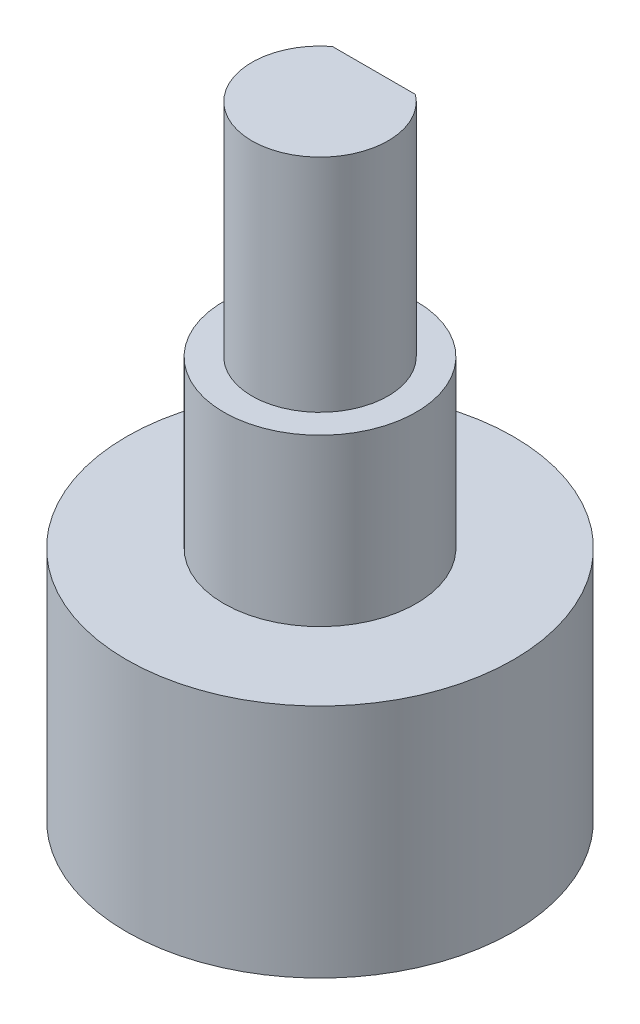
ISO-10303-21;
HEADER;
FILE_DESCRIPTION(('STEP AP214'),'2;1');
FILE_NAME('part.step','',(''),(''),'','','');
FILE_SCHEMA(('AUTOMOTIVE_DESIGN { 1 0 10303 214 1 1 1 1 }'));
ENDSEC;
DATA;
#1=APPLICATION_CONTEXT('core data for automotive mechanical design processes');
#2=APPLICATION_PROTOCOL_DEFINITION('international standard','automotive_design',2000,#1);
#3=PRODUCT_CONTEXT('',#1,'mechanical');
#4=PRODUCT('Part','Part','',(#3));
#5=PRODUCT_RELATED_PRODUCT_CATEGORY('part','',(#4));
#6=PRODUCT_DEFINITION_FORMATION('','',#4);
#7=PRODUCT_DEFINITION_CONTEXT('part definition',#1,'design');
#8=PRODUCT_DEFINITION('design','',#6,#7);
#9=PRODUCT_DEFINITION_SHAPE('','',#8);
#10=(LENGTH_UNIT() NAMED_UNIT(*) SI_UNIT(.MILLI.,.METRE.));
#11=(NAMED_UNIT(*) PLANE_ANGLE_UNIT() SI_UNIT($,.RADIAN.));
#12=(NAMED_UNIT(*) SI_UNIT($,.STERADIAN.) SOLID_ANGLE_UNIT());
#13=UNCERTAINTY_MEASURE_WITH_UNIT(LENGTH_MEASURE(1.E-05),#10,'distance_accuracy_value','');
#14=(GEOMETRIC_REPRESENTATION_CONTEXT(3) GLOBAL_UNCERTAINTY_ASSIGNED_CONTEXT((#13)) GLOBAL_UNIT_ASSIGNED_CONTEXT((#10,
#11,#12)) REPRESENTATION_CONTEXT('',''));
#15=CARTESIAN_POINT('',(0.,0.,0.));
#16=DIRECTION('',(0.,0.,1.));
#17=DIRECTION('',(1.,0.,0.));
#18=AXIS2_PLACEMENT_3D('',#15,#16,#17);
#19=CARTESIAN_POINT('',(0.,23.065,0.));
#20=DIRECTION('',(0.,1.,0.));
#21=DIRECTION('',(0.,0.,1.));
#22=AXIS2_PLACEMENT_3D('',#19,#20,#21);
#23=PLANE('',#22);
#24=CARTESIAN_POINT('',(0.,23.065,0.));
#25=DIRECTION('',(0.,1.,0.));
#26=DIRECTION('',(0.,0.,1.));
#27=AXIS2_PLACEMENT_3D('',#24,#25,#26);
#28=CIRCLE('',#27,5.5245);
#29=CARTESIAN_POINT('',(0.,23.065,-5.5245));
#30=VERTEX_POINT('',#29);
#31=EDGE_CURVE('E79',#30,#30,#28,.T.);
#32=ORIENTED_EDGE('',*,*,#31,.T.);
#33=EDGE_LOOP('',(#32));
#34=FACE_BOUND('',#33,.T.);
#35=DIRECTION('',(-1.,0.,0.));
#36=VECTOR('',#35,1.);
#37=CARTESIAN_POINT('',(2.38705951329245,23.065,-3.0988));
#38=LINE('',#37,#36);
#39=CARTESIAN_POINT('',(2.38705951329245,23.065,-3.0988));
#40=VERTEX_POINT('',#39);
#41=CARTESIAN_POINT('',(-2.38705951329245,23.065,-3.0988));
#42=VERTEX_POINT('',#41);
#43=EDGE_CURVE('E63',#40,#42,#38,.T.);
#44=ORIENTED_EDGE('',*,*,#43,.F.);
#45=CARTESIAN_POINT('',(0.,23.065,0.));
#46=DIRECTION('',(0.,1.,0.));
#47=DIRECTION('',(0.,0.,1.));
#48=AXIS2_PLACEMENT_3D('',#45,#46,#47);
#49=CIRCLE('',#48,3.9116);
#50=EDGE_CURVE('E48',#42,#40,#49,.T.);
#51=ORIENTED_EDGE('',*,*,#50,.F.);
#52=EDGE_LOOP('',(#44,#51));
#53=FACE_BOUND('',#52,.T.);
#54=ADVANCED_FACE('F33',(#34,#53),#23,.T.);
#55=CARTESIAN_POINT('',(0.,13.54,0.));
#56=DIRECTION('',(0.,-1.,0.));
#57=DIRECTION('',(0.,0.,-1.));
#58=AXIS2_PLACEMENT_3D('',#55,#56,#57);
#59=CYLINDRICAL_SURFACE('',#58,11.1125);
#60=CARTESIAN_POINT('',(0.,13.54,0.));
#61=DIRECTION('',(0.,1.,0.));
#62=DIRECTION('',(0.,0.,1.));
#63=AXIS2_PLACEMENT_3D('',#60,#61,#62);
#64=CIRCLE('',#63,11.1125);
#65=CARTESIAN_POINT('',(0.,13.54,11.1125));
#66=VERTEX_POINT('',#65);
#67=EDGE_CURVE('E11',#66,#66,#64,.T.);
#68=ORIENTED_EDGE('',*,*,#67,.F.);
#69=EDGE_LOOP('',(#68));
#70=FACE_BOUND('',#69,.T.);
#71=CARTESIAN_POINT('',(0.,0.,0.));
#72=DIRECTION('',(0.,1.,0.));
#73=DIRECTION('',(0.,0.,1.));
#74=AXIS2_PLACEMENT_3D('',#71,#72,#73);
#75=CIRCLE('',#74,11.1125);
#76=CARTESIAN_POINT('',(0.,0.,11.1125));
#77=VERTEX_POINT('',#76);
#78=EDGE_CURVE('E37',#77,#77,#75,.T.);
#79=ORIENTED_EDGE('',*,*,#78,.T.);
#80=EDGE_LOOP('',(#79));
#81=FACE_BOUND('',#80,.T.);
#82=ADVANCED_FACE('F35',(#70,#81),#59,.T.);
#83=CARTESIAN_POINT('',(0.,13.54,0.));
#84=DIRECTION('',(0.,1.,0.));
#85=DIRECTION('',(0.,0.,1.));
#86=AXIS2_PLACEMENT_3D('',#83,#84,#85);
#87=PLANE('',#86);
#88=CARTESIAN_POINT('',(0.,13.54,0.));
#89=DIRECTION('',(0.,1.,0.));
#90=DIRECTION('',(0.,0.,1.));
#91=AXIS2_PLACEMENT_3D('',#88,#89,#90);
#92=CIRCLE('',#91,5.5245);
#93=CARTESIAN_POINT('',(0.,13.54,-5.5245));
#94=VERTEX_POINT('',#93);
#95=EDGE_CURVE('E78',#94,#94,#92,.T.);
#96=ORIENTED_EDGE('',*,*,#95,.F.);
#97=EDGE_LOOP('',(#96));
#98=FACE_BOUND('',#97,.T.);
#99=ORIENTED_EDGE('',*,*,#67,.T.);
#100=EDGE_LOOP('',(#99));
#101=FACE_BOUND('',#100,.T.);
#102=ADVANCED_FACE('F87',(#98,#101),#87,.T.);
#103=CARTESIAN_POINT('',(0.,0.,0.));
#104=DIRECTION('',(0.,1.,0.));
#105=DIRECTION('',(0.,0.,1.));
#106=AXIS2_PLACEMENT_3D('',#103,#104,#105);
#107=PLANE('',#106);
#108=ORIENTED_EDGE('',*,*,#78,.F.);
#109=EDGE_LOOP('',(#108));
#110=FACE_BOUND('',#109,.T.);
#111=ADVANCED_FACE('F90',(#110),#107,.F.);
#112=CARTESIAN_POINT('',(0.,23.065,0.));
#113=DIRECTION('',(0.,-1.,0.));
#114=DIRECTION('',(0.,0.,-1.));
#115=AXIS2_PLACEMENT_3D('',#112,#113,#114);
#116=CYLINDRICAL_SURFACE('',#115,5.5245);
#117=CARTESIAN_POINT('',(0.,23.065,-5.5245));
#118=CARTESIAN_POINT('',(0.,22.96578125,-5.5245));
#119=CARTESIAN_POINT('',(0.,22.8665625,-5.5245));
#120=CARTESIAN_POINT('',(0.,22.668125,-5.5245));
#121=CARTESIAN_POINT('',(0.,22.56890625,-5.5245));
#122=CARTESIAN_POINT('',(0.,22.37046875,-5.5245));
#123=CARTESIAN_POINT('',(0.,22.27125,-5.5245));
#124=CARTESIAN_POINT('',(0.,22.0728125,-5.5245));
#125=CARTESIAN_POINT('',(0.,21.97359375,-5.5245));
#126=CARTESIAN_POINT('',(0.,21.77515625,-5.5245));
#127=CARTESIAN_POINT('',(0.,21.6759375,-5.5245));
#128=CARTESIAN_POINT('',(0.,21.4775,-5.5245));
#129=CARTESIAN_POINT('',(0.,21.37828125,-5.5245));
#130=CARTESIAN_POINT('',(0.,21.17984375,-5.5245));
#131=CARTESIAN_POINT('',(0.,21.080625,-5.5245));
#132=CARTESIAN_POINT('',(0.,20.8821875,-5.5245));
#133=CARTESIAN_POINT('',(0.,20.78296875,-5.5245));
#134=CARTESIAN_POINT('',(0.,20.58453125,-5.5245));
#135=CARTESIAN_POINT('',(0.,20.4853125,-5.5245));
#136=CARTESIAN_POINT('',(0.,20.286875,-5.5245));
#137=CARTESIAN_POINT('',(0.,20.18765625,-5.5245));
#138=CARTESIAN_POINT('',(0.,19.98921875,-5.5245));
#139=CARTESIAN_POINT('',(0.,19.89,-5.5245));
#140=CARTESIAN_POINT('',(0.,19.6915625,-5.5245));
#141=CARTESIAN_POINT('',(0.,19.59234375,-5.5245));
#142=CARTESIAN_POINT('',(0.,19.39390625,-5.5245));
#143=CARTESIAN_POINT('',(0.,19.2946875,-5.5245));
#144=CARTESIAN_POINT('',(0.,19.09625,-5.5245));
#145=CARTESIAN_POINT('',(0.,18.99703125,-5.5245));
#146=CARTESIAN_POINT('',(0.,18.79859375,-5.5245));
#147=CARTESIAN_POINT('',(0.,18.699375,-5.5245));
#148=CARTESIAN_POINT('',(0.,18.5009375,-5.5245));
#149=CARTESIAN_POINT('',(0.,18.40171875,-5.5245));
#150=CARTESIAN_POINT('',(0.,18.20328125,-5.5245));
#151=CARTESIAN_POINT('',(0.,18.1040625,-5.5245));
#152=CARTESIAN_POINT('',(0.,17.905625,-5.5245));
#153=CARTESIAN_POINT('',(0.,17.80640625,-5.5245));
#154=CARTESIAN_POINT('',(0.,17.60796875,-5.5245));
#155=CARTESIAN_POINT('',(0.,17.50875,-5.5245));
#156=CARTESIAN_POINT('',(0.,17.3103125,-5.5245));
#157=CARTESIAN_POINT('',(0.,17.21109375,-5.5245));
#158=CARTESIAN_POINT('',(0.,17.01265625,-5.5245));
#159=CARTESIAN_POINT('',(0.,16.9134375,-5.5245));
#160=CARTESIAN_POINT('',(0.,16.715,-5.5245));
#161=CARTESIAN_POINT('',(0.,16.61578125,-5.5245));
#162=CARTESIAN_POINT('',(0.,16.41734375,-5.5245));
#163=CARTESIAN_POINT('',(0.,16.318125,-5.5245));
#164=CARTESIAN_POINT('',(0.,16.1196875,-5.5245));
#165=CARTESIAN_POINT('',(0.,16.02046875,-5.5245));
#166=CARTESIAN_POINT('',(0.,15.82203125,-5.5245));
#167=CARTESIAN_POINT('',(0.,15.7228125,-5.5245));
#168=CARTESIAN_POINT('',(0.,15.524375,-5.5245));
#169=CARTESIAN_POINT('',(0.,15.42515625,-5.5245));
#170=CARTESIAN_POINT('',(0.,15.22671875,-5.5245));
#171=CARTESIAN_POINT('',(0.,15.1275,-5.5245));
#172=CARTESIAN_POINT('',(0.,14.9290625,-5.5245));
#173=CARTESIAN_POINT('',(0.,14.82984375,-5.5245));
#174=CARTESIAN_POINT('',(0.,14.63140625,-5.5245));
#175=CARTESIAN_POINT('',(0.,14.5321875,-5.5245));
#176=CARTESIAN_POINT('',(0.,14.33375,-5.5245));
#177=CARTESIAN_POINT('',(0.,14.23453125,-5.5245));
#178=CARTESIAN_POINT('',(0.,14.03609375,-5.5245));
#179=CARTESIAN_POINT('',(0.,13.936875,-5.5245));
#180=CARTESIAN_POINT('',(0.,13.7384375,-5.5245));
#181=CARTESIAN_POINT('',(0.,13.63921875,-5.5245));
#182=CARTESIAN_POINT('',(0.,13.54,-5.5245));
#183=B_SPLINE_CURVE_WITH_KNOTS('',3,(#117,#118,#119,#120,#121,#122,#123,#124,#125,#126,#127,
#128,#129,#130,#131,#132,#133,#134,#135,#136,#137,#138,#139,#140,#141,#142,#143,#144,#145,#146,
#147,#148,#149,#150,#151,#152,#153,#154,#155,#156,#157,#158,#159,#160,#161,#162,#163,#164,#165,
#166,#167,#168,#169,#170,#171,#172,#173,#174,#175,#176,#177,#178,#179,#180,#181,#182),
.UNSPECIFIED.,.F.,.F.,(4,2,2,2,2,2,2,2,2,2,2,2,2,2,2,2,2,2,2,2,2,2,2,2,2,2,2,2,2,2,2,2,4),(0.,
0.297656249999997,0.595312499999997,0.892968749999997,1.190625,1.48828125,1.7859375,2.08359375,
2.38125,2.67890625,2.9765625,3.27421875,3.571875,3.86953125,4.1671875,4.46484375,4.7625,
5.06015625,5.3578125,5.65546875,5.953125,6.25078125,6.5484375,6.84609375,7.14375,7.44140625,
7.7390625,8.03671875,8.334375,8.63203125,8.9296875,9.22734375,9.525),.UNSPECIFIED.);
#184=EDGE_CURVE('BSEAM85',#30,#94,#183,.T.);
#185=ORIENTED_EDGE('',*,*,#31,.F.);
#186=ORIENTED_EDGE('',*,*,#95,.T.);
#187=ORIENTED_EDGE('',*,*,#184,.T.);
#188=ORIENTED_EDGE('',*,*,#184,.F.);
#189=EDGE_LOOP('',(#185,#187,#186,#188));
#190=FACE_BOUND('',#189,.T.);
#191=ADVANCED_FACE('F85',(#190),#116,.T.);
#192=CARTESIAN_POINT('',(0.,35.765,0.));
#193=DIRECTION('',(0.,-1.,0.));
#194=DIRECTION('',(0.,0.,-1.));
#195=AXIS2_PLACEMENT_3D('',#192,#193,#194);
#196=CYLINDRICAL_SURFACE('',#195,3.9116);
#197=ORIENTED_EDGE('',*,*,#50,.T.);
#198=DIRECTION('',(0.,-1.,0.));
#199=VECTOR('',#198,1.);
#200=CARTESIAN_POINT('',(2.38705951329245,35.765,-3.0988));
#201=LINE('',#200,#199);
#202=CARTESIAN_POINT('',(2.38705951329245,35.765,-3.0988));
#203=VERTEX_POINT('',#202);
#204=EDGE_CURVE('E67',#203,#40,#201,.T.);
#205=ORIENTED_EDGE('',*,*,#204,.F.);
#206=CARTESIAN_POINT('',(0.,35.765,0.));
#207=DIRECTION('',(0.,1.,0.));
#208=DIRECTION('',(0.,0.,1.));
#209=AXIS2_PLACEMENT_3D('',#206,#207,#208);
#210=CIRCLE('',#209,3.9116);
#211=CARTESIAN_POINT('',(-2.38705951329245,35.765,-3.0988));
#212=VERTEX_POINT('',#211);
#213=EDGE_CURVE('E69',#212,#203,#210,.T.);
#214=ORIENTED_EDGE('',*,*,#213,.F.);
#215=DIRECTION('',(0.,-1.,0.));
#216=VECTOR('',#215,1.);
#217=CARTESIAN_POINT('',(-2.38705951329245,35.765,-3.0988));
#218=LINE('',#217,#216);
#219=EDGE_CURVE('E65',#212,#42,#218,.T.);
#220=ORIENTED_EDGE('',*,*,#219,.T.);
#221=EDGE_LOOP('',(#197,#205,#214,#220));
#222=FACE_BOUND('',#221,.T.);
#223=ADVANCED_FACE('F71',(#222),#196,.T.);
#224=CARTESIAN_POINT('',(2.38705951329245,35.765,-3.0988));
#225=DIRECTION('',(0.,0.,1.));
#226=DIRECTION('',(1.,0.,0.));
#227=AXIS2_PLACEMENT_3D('',#224,#225,#226);
#228=PLANE('',#227);
#229=ORIENTED_EDGE('',*,*,#43,.T.);
#230=ORIENTED_EDGE('',*,*,#219,.F.);
#231=DIRECTION('',(-1.,0.,0.));
#232=VECTOR('',#231,1.);
#233=CARTESIAN_POINT('',(2.38705951329245,35.765,-3.0988));
#234=LINE('',#233,#232);
#235=EDGE_CURVE('E56',#203,#212,#234,.T.);
#236=ORIENTED_EDGE('',*,*,#235,.F.);
#237=ORIENTED_EDGE('',*,*,#204,.T.);
#238=EDGE_LOOP('',(#229,#230,#236,#237));
#239=FACE_BOUND('',#238,.T.);
#240=ADVANCED_FACE('F64',(#239),#228,.F.);
#241=CARTESIAN_POINT('',(0.,35.765,0.));
#242=DIRECTION('',(0.,1.,0.));
#243=DIRECTION('',(0.,0.,1.));
#244=AXIS2_PLACEMENT_3D('',#241,#242,#243);
#245=PLANE('',#244);
#246=ORIENTED_EDGE('',*,*,#213,.T.);
#247=ORIENTED_EDGE('',*,*,#235,.T.);
#248=EDGE_LOOP('',(#246,#247));
#249=FACE_BOUND('',#248,.T.);
#250=ADVANCED_FACE('F115',(#249),#245,.T.);
#251=CLOSED_SHELL('',(#54,#82,#102,#111,#191,#223,#240,#250));
#252=MANIFOLD_SOLID_BREP('B2',#251);
#253=ADVANCED_BREP_SHAPE_REPRESENTATION('',(#18,#252),#14);
#254=SHAPE_DEFINITION_REPRESENTATION(#9,#253);
ENDSEC;
END-ISO-10303-21;
